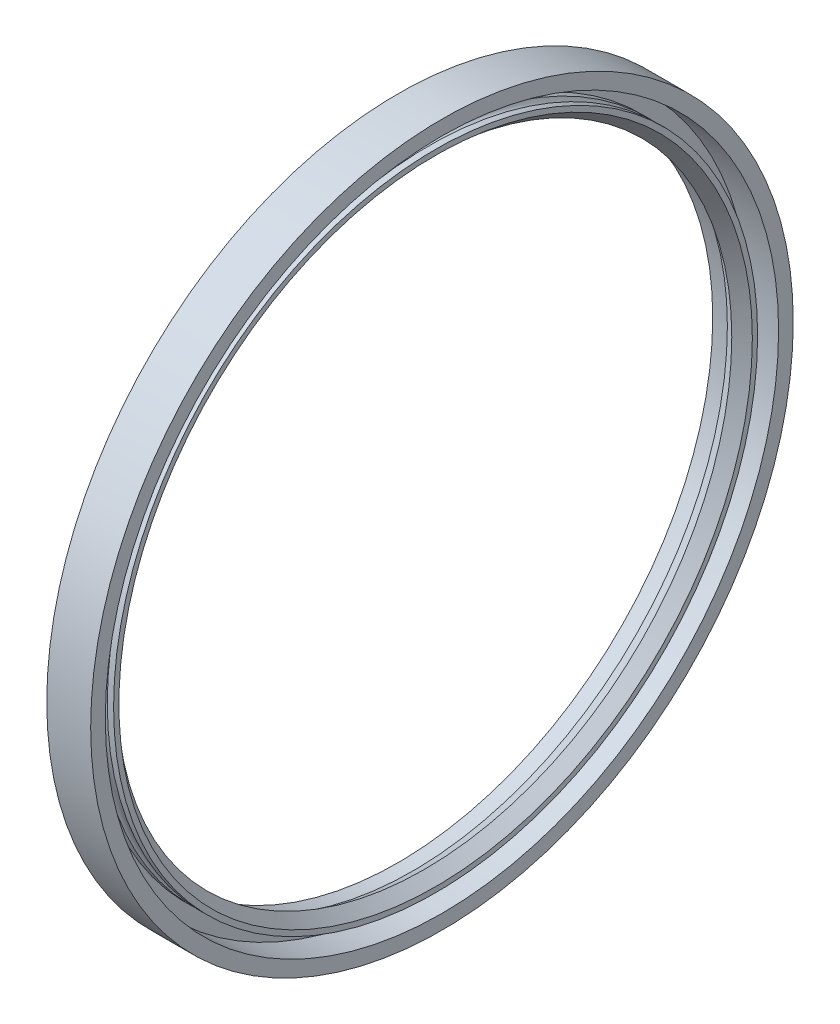
ISO-10303-21;
HEADER;
FILE_DESCRIPTION(('STEP AP214'),'2;1');
FILE_NAME('part.step','',(''),(''),'','','');
FILE_SCHEMA(('AUTOMOTIVE_DESIGN { 1 0 10303 214 1 1 1 1 }'));
ENDSEC;
DATA;
#1=APPLICATION_CONTEXT('core data for automotive mechanical design processes');
#2=APPLICATION_PROTOCOL_DEFINITION('international standard','automotive_design',2000,#1);
#3=PRODUCT_CONTEXT('',#1,'mechanical');
#4=PRODUCT('Part','Part','',(#3));
#5=PRODUCT_RELATED_PRODUCT_CATEGORY('part','',(#4));
#6=PRODUCT_DEFINITION_FORMATION('','',#4);
#7=PRODUCT_DEFINITION_CONTEXT('part definition',#1,'design');
#8=PRODUCT_DEFINITION('design','',#6,#7);
#9=PRODUCT_DEFINITION_SHAPE('','',#8);
#10=(LENGTH_UNIT() NAMED_UNIT(*) SI_UNIT(.MILLI.,.METRE.));
#11=(NAMED_UNIT(*) PLANE_ANGLE_UNIT() SI_UNIT($,.RADIAN.));
#12=(NAMED_UNIT(*) SI_UNIT($,.STERADIAN.) SOLID_ANGLE_UNIT());
#13=UNCERTAINTY_MEASURE_WITH_UNIT(LENGTH_MEASURE(1.E-05),#10,'distance_accuracy_value','');
#14=(GEOMETRIC_REPRESENTATION_CONTEXT(3) GLOBAL_UNCERTAINTY_ASSIGNED_CONTEXT((#13)) GLOBAL_UNIT_ASSIGNED_CONTEXT((#10,
#11,#12)) REPRESENTATION_CONTEXT('',''));
#15=CARTESIAN_POINT('',(0.,0.,0.));
#16=DIRECTION('',(0.,0.,1.));
#17=DIRECTION('',(1.,0.,0.));
#18=AXIS2_PLACEMENT_3D('',#15,#16,#17);
#19=CARTESIAN_POINT('',(15.,115.,0.));
#20=DIRECTION('',(1.,0.,0.));
#21=DIRECTION('',(0.,0.,-1.));
#22=AXIS2_PLACEMENT_3D('',#19,#20,#21);
#23=PLANE('',#22);
#24=CARTESIAN_POINT('',(15.,0.,0.));
#25=DIRECTION('',(1.,0.,0.));
#26=DIRECTION('',(0.,0.,-1.));
#27=AXIS2_PLACEMENT_3D('',#24,#25,#26);
#28=CIRCLE('',#27,120.);
#29=CARTESIAN_POINT('',(15.,0.,-120.));
#30=VERTEX_POINT('',#29);
#31=EDGE_CURVE('E10',#30,#30,#28,.T.);
#32=ORIENTED_EDGE('',*,*,#31,.T.);
#33=EDGE_LOOP('',(#32));
#34=FACE_BOUND('',#33,.T.);
#35=CARTESIAN_POINT('',(15.,0.,0.));
#36=DIRECTION('',(1.,0.,0.));
#37=DIRECTION('',(0.,0.,-1.));
#38=AXIS2_PLACEMENT_3D('',#35,#36,#37);
#39=CIRCLE('',#38,115.);
#40=CARTESIAN_POINT('',(15.,0.,-115.));
#41=VERTEX_POINT('',#40);
#42=EDGE_CURVE('E81',#41,#41,#39,.T.);
#43=ORIENTED_EDGE('',*,*,#42,.F.);
#44=EDGE_LOOP('',(#43));
#45=FACE_BOUND('',#44,.T.);
#46=ADVANCED_FACE('F41',(#34,#45),#23,.T.);
#47=CARTESIAN_POINT('',(-0.00500000000006658,0.,0.));
#48=DIRECTION('',(1.,0.,0.));
#49=DIRECTION('',(0.,0.,-1.));
#50=AXIS2_PLACEMENT_3D('',#47,#48,#49);
#51=CYLINDRICAL_SURFACE('',#50,120.);
#52=CARTESIAN_POINT('',(0.,0.,0.));
#53=DIRECTION('',(1.,0.,0.));
#54=DIRECTION('',(0.,0.,-1.));
#55=AXIS2_PLACEMENT_3D('',#52,#53,#54);
#56=CIRCLE('',#55,120.);
#57=CARTESIAN_POINT('',(0.,0.,-120.));
#58=VERTEX_POINT('',#57);
#59=EDGE_CURVE('E47',#58,#58,#56,.T.);
#60=ORIENTED_EDGE('',*,*,#59,.T.);
#61=EDGE_LOOP('',(#60));
#62=FACE_BOUND('',#61,.T.);
#63=ORIENTED_EDGE('',*,*,#31,.F.);
#64=EDGE_LOOP('',(#63));
#65=FACE_BOUND('',#64,.T.);
#66=ADVANCED_FACE('F89',(#62,#65),#51,.T.);
#67=CARTESIAN_POINT('',(0.,120.,0.));
#68=DIRECTION('',(-1.,0.,0.));
#69=DIRECTION('',(0.,0.,1.));
#70=AXIS2_PLACEMENT_3D('',#67,#68,#69);
#71=PLANE('',#70);
#72=CARTESIAN_POINT('',(0.,0.,0.));
#73=DIRECTION('',(1.,0.,0.));
#74=DIRECTION('',(0.,0.,-1.));
#75=AXIS2_PLACEMENT_3D('',#72,#73,#74);
#76=CIRCLE('',#75,107.5);
#77=CARTESIAN_POINT('',(0.,0.,-107.5));
#78=VERTEX_POINT('',#77);
#79=EDGE_CURVE('E51',#78,#78,#76,.T.);
#80=ORIENTED_EDGE('',*,*,#79,.T.);
#81=EDGE_LOOP('',(#80));
#82=FACE_BOUND('',#81,.T.);
#83=ORIENTED_EDGE('',*,*,#59,.F.);
#84=EDGE_LOOP('',(#83));
#85=FACE_BOUND('',#84,.T.);
#86=ADVANCED_FACE('F93',(#82,#85),#71,.T.);
#87=CARTESIAN_POINT('',(-0.00500000000006658,0.,0.));
#88=DIRECTION('',(1.,0.,0.));
#89=DIRECTION('',(0.,0.,-1.));
#90=AXIS2_PLACEMENT_3D('',#87,#88,#89);
#91=CYLINDRICAL_SURFACE('',#90,107.5);
#92=CARTESIAN_POINT('',(5.,0.,0.));
#93=DIRECTION('',(1.,0.,0.));
#94=DIRECTION('',(0.,0.,-1.));
#95=AXIS2_PLACEMENT_3D('',#92,#93,#94);
#96=CIRCLE('',#95,107.5);
#97=CARTESIAN_POINT('',(5.,0.,-107.5));
#98=VERTEX_POINT('',#97);
#99=EDGE_CURVE('E55',#98,#98,#96,.T.);
#100=ORIENTED_EDGE('',*,*,#99,.T.);
#101=EDGE_LOOP('',(#100));
#102=FACE_BOUND('',#101,.T.);
#103=ORIENTED_EDGE('',*,*,#79,.F.);
#104=EDGE_LOOP('',(#103));
#105=FACE_BOUND('',#104,.T.);
#106=ADVANCED_FACE('F97',(#102,#105),#91,.F.);
#107=CARTESIAN_POINT('',(5.,0.,0.));
#108=DIRECTION('',(-1.,0.,0.));
#109=DIRECTION('',(0.,0.,1.));
#110=AXIS2_PLACEMENT_3D('',#107,#108,#109);
#111=CONICAL_SURFACE('',#110,107.5,0.558599315343565);
#112=CARTESIAN_POINT('',(8.99999999999998,0.,0.));
#113=DIRECTION('',(1.,0.,0.));
#114=DIRECTION('',(0.,0.,-1.));
#115=AXIS2_PLACEMENT_3D('',#112,#113,#114);
#116=CIRCLE('',#115,105.);
#117=CARTESIAN_POINT('',(8.99999999999998,0.,-105.));
#118=VERTEX_POINT('',#117);
#119=EDGE_CURVE('E60',#118,#118,#116,.T.);
#120=ORIENTED_EDGE('',*,*,#119,.T.);
#121=EDGE_LOOP('',(#120));
#122=FACE_BOUND('',#121,.T.);
#123=ORIENTED_EDGE('',*,*,#99,.F.);
#124=EDGE_LOOP('',(#123));
#125=FACE_BOUND('',#124,.T.);
#126=ADVANCED_FACE('F104',(#122,#125),#111,.F.);
#127=CARTESIAN_POINT('',(8.99999999999998,0.,0.));
#128=DIRECTION('',(1.,0.,0.));
#129=DIRECTION('',(0.,0.,-1.));
#130=AXIS2_PLACEMENT_3D('',#127,#128,#129);
#131=CONICAL_SURFACE('',#130,105.,0.694738276196185);
#132=CARTESIAN_POINT('',(12.8333335,0.,0.));
#133=DIRECTION('',(1.,0.,0.));
#134=DIRECTION('',(0.,0.,-1.));
#135=AXIS2_PLACEMENT_3D('',#132,#133,#134);
#136=CIRCLE('',#135,108.19444458333);
#137=CARTESIAN_POINT('',(12.8333335,0.,-108.19444458333));
#138=VERTEX_POINT('',#137);
#139=EDGE_CURVE('E63',#138,#138,#136,.T.);
#140=ORIENTED_EDGE('',*,*,#139,.T.);
#141=EDGE_LOOP('',(#140));
#142=FACE_BOUND('',#141,.T.);
#143=ORIENTED_EDGE('',*,*,#119,.F.);
#144=EDGE_LOOP('',(#143));
#145=FACE_BOUND('',#144,.T.);
#146=ADVANCED_FACE('F108',(#142,#145),#131,.F.);
#147=CARTESIAN_POINT('',(12.8333335,108.19444458333,0.));
#148=DIRECTION('',(1.,0.,0.));
#149=DIRECTION('',(0.,0.,-1.));
#150=AXIS2_PLACEMENT_3D('',#147,#148,#149);
#151=PLANE('',#150);
#152=CARTESIAN_POINT('',(12.8333335,0.,0.));
#153=DIRECTION('',(1.,0.,0.));
#154=DIRECTION('',(0.,0.,-1.));
#155=AXIS2_PLACEMENT_3D('',#152,#153,#154);
#156=CIRCLE('',#155,110.);
#157=CARTESIAN_POINT('',(12.8333335,0.,-110.));
#158=VERTEX_POINT('',#157);
#159=EDGE_CURVE('E66',#158,#158,#156,.T.);
#160=ORIENTED_EDGE('',*,*,#159,.T.);
#161=EDGE_LOOP('',(#160));
#162=FACE_BOUND('',#161,.T.);
#163=ORIENTED_EDGE('',*,*,#139,.F.);
#164=EDGE_LOOP('',(#163));
#165=FACE_BOUND('',#164,.T.);
#166=ADVANCED_FACE('F112',(#162,#165),#151,.T.);
#167=CARTESIAN_POINT('',(-0.00500000000006658,0.,0.));
#168=DIRECTION('',(1.,0.,0.));
#169=DIRECTION('',(0.,0.,-1.));
#170=AXIS2_PLACEMENT_3D('',#167,#168,#169);
#171=CYLINDRICAL_SURFACE('',#170,110.);
#172=CARTESIAN_POINT('',(10.666667,0.,0.));
#173=DIRECTION('',(1.,0.,0.));
#174=DIRECTION('',(0.,0.,-1.));
#175=AXIS2_PLACEMENT_3D('',#172,#173,#174);
#176=CIRCLE('',#175,110.);
#177=CARTESIAN_POINT('',(10.666667,0.,-110.));
#178=VERTEX_POINT('',#177);
#179=EDGE_CURVE('E69',#178,#178,#176,.T.);
#180=ORIENTED_EDGE('',*,*,#179,.T.);
#181=EDGE_LOOP('',(#180));
#182=FACE_BOUND('',#181,.T.);
#183=ORIENTED_EDGE('',*,*,#159,.F.);
#184=EDGE_LOOP('',(#183));
#185=FACE_BOUND('',#184,.T.);
#186=ADVANCED_FACE('F116',(#182,#185),#171,.T.);
#187=CARTESIAN_POINT('',(9.,0.,0.));
#188=DIRECTION('',(1.,0.,0.));
#189=DIRECTION('',(0.,0.,-1.));
#190=AXIS2_PLACEMENT_3D('',#187,#188,#189);
#191=TOROIDAL_SURFACE('',#190,110.,1.666667);
#192=CARTESIAN_POINT('',(7.333333,0.,0.));
#193=DIRECTION('',(1.,0.,0.));
#194=DIRECTION('',(0.,0.,-1.));
#195=AXIS2_PLACEMENT_3D('',#192,#193,#194);
#196=CIRCLE('',#195,110.);
#197=CARTESIAN_POINT('',(7.333333,0.,-110.));
#198=VERTEX_POINT('',#197);
#199=EDGE_CURVE('E72',#198,#198,#196,.T.);
#200=ORIENTED_EDGE('',*,*,#199,.T.);
#201=EDGE_LOOP('',(#200));
#202=FACE_BOUND('',#201,.T.);
#203=ORIENTED_EDGE('',*,*,#179,.F.);
#204=EDGE_LOOP('',(#203));
#205=FACE_BOUND('',#204,.T.);
#206=ADVANCED_FACE('F120',(#202,#205),#191,.F.);
#207=CARTESIAN_POINT('',(-0.00500000000006658,0.,0.));
#208=DIRECTION('',(1.,0.,0.));
#209=DIRECTION('',(0.,0.,-1.));
#210=AXIS2_PLACEMENT_3D('',#207,#208,#209);
#211=CYLINDRICAL_SURFACE('',#210,110.);
#212=CARTESIAN_POINT('',(5.,0.,0.));
#213=DIRECTION('',(1.,0.,0.));
#214=DIRECTION('',(0.,0.,-1.));
#215=AXIS2_PLACEMENT_3D('',#212,#213,#214);
#216=CIRCLE('',#215,110.);
#217=CARTESIAN_POINT('',(5.,0.,-110.));
#218=VERTEX_POINT('',#217);
#219=EDGE_CURVE('E75',#218,#218,#216,.T.);
#220=ORIENTED_EDGE('',*,*,#219,.T.);
#221=EDGE_LOOP('',(#220));
#222=FACE_BOUND('',#221,.T.);
#223=ORIENTED_EDGE('',*,*,#199,.F.);
#224=EDGE_LOOP('',(#223));
#225=FACE_BOUND('',#224,.T.);
#226=ADVANCED_FACE('F124',(#222,#225),#211,.T.);
#227=CARTESIAN_POINT('',(5.,110.,0.));
#228=DIRECTION('',(1.,0.,0.));
#229=DIRECTION('',(0.,0.,-1.));
#230=AXIS2_PLACEMENT_3D('',#227,#228,#229);
#231=PLANE('',#230);
#232=CARTESIAN_POINT('',(5.,0.,0.));
#233=DIRECTION('',(1.,0.,0.));
#234=DIRECTION('',(0.,0.,-1.));
#235=AXIS2_PLACEMENT_3D('',#232,#233,#234);
#236=CIRCLE('',#235,115.);
#237=CARTESIAN_POINT('',(5.,0.,-115.));
#238=VERTEX_POINT('',#237);
#239=EDGE_CURVE('E78',#238,#238,#236,.T.);
#240=ORIENTED_EDGE('',*,*,#239,.T.);
#241=EDGE_LOOP('',(#240));
#242=FACE_BOUND('',#241,.T.);
#243=ORIENTED_EDGE('',*,*,#219,.F.);
#244=EDGE_LOOP('',(#243));
#245=FACE_BOUND('',#244,.T.);
#246=ADVANCED_FACE('F128',(#242,#245),#231,.T.);
#247=CARTESIAN_POINT('',(-0.00500000000006658,0.,0.));
#248=DIRECTION('',(1.,0.,0.));
#249=DIRECTION('',(0.,0.,-1.));
#250=AXIS2_PLACEMENT_3D('',#247,#248,#249);
#251=CYLINDRICAL_SURFACE('',#250,115.);
#252=ORIENTED_EDGE('',*,*,#42,.T.);
#253=EDGE_LOOP('',(#252));
#254=FACE_BOUND('',#253,.T.);
#255=ORIENTED_EDGE('',*,*,#239,.F.);
#256=EDGE_LOOP('',(#255));
#257=FACE_BOUND('',#256,.T.);
#258=ADVANCED_FACE('F85',(#254,#257),#251,.F.);
#259=CLOSED_SHELL('',(#46,#66,#86,#106,#126,#146,#166,#186,#206,#226,#246,#258));
#260=MANIFOLD_SOLID_BREP('B2',#259);
#261=ADVANCED_BREP_SHAPE_REPRESENTATION('',(#18,#260),#14);
#262=SHAPE_DEFINITION_REPRESENTATION(#9,#261);
ENDSEC;
END-ISO-10303-21;
